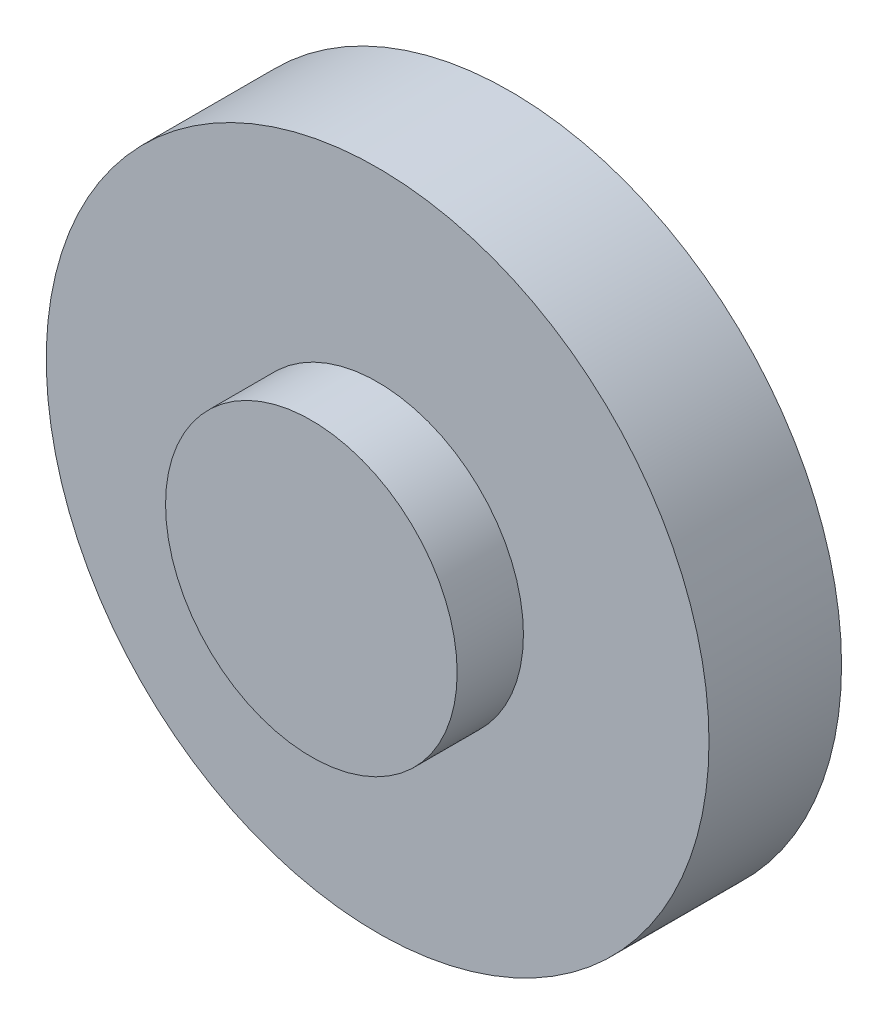
ISO-10303-21;
HEADER;
FILE_DESCRIPTION(('STEP AP214'),'2;1');
FILE_NAME('part.step','',(''),(''),'','','');
FILE_SCHEMA(('AUTOMOTIVE_DESIGN { 1 0 10303 214 1 1 1 1 }'));
ENDSEC;
DATA;
#1=APPLICATION_CONTEXT('core data for automotive mechanical design processes');
#2=APPLICATION_PROTOCOL_DEFINITION('international standard','automotive_design',2000,#1);
#3=PRODUCT_CONTEXT('',#1,'mechanical');
#4=PRODUCT('Part','Part','',(#3));
#5=PRODUCT_RELATED_PRODUCT_CATEGORY('part','',(#4));
#6=PRODUCT_DEFINITION_FORMATION('','',#4);
#7=PRODUCT_DEFINITION_CONTEXT('part definition',#1,'design');
#8=PRODUCT_DEFINITION('design','',#6,#7);
#9=PRODUCT_DEFINITION_SHAPE('','',#8);
#10=(LENGTH_UNIT() NAMED_UNIT(*) SI_UNIT(.MILLI.,.METRE.));
#11=(NAMED_UNIT(*) PLANE_ANGLE_UNIT() SI_UNIT($,.RADIAN.));
#12=(NAMED_UNIT(*) SI_UNIT($,.STERADIAN.) SOLID_ANGLE_UNIT());
#13=UNCERTAINTY_MEASURE_WITH_UNIT(LENGTH_MEASURE(1.E-05),#10,'distance_accuracy_value','');
#14=(GEOMETRIC_REPRESENTATION_CONTEXT(3) GLOBAL_UNCERTAINTY_ASSIGNED_CONTEXT((#13)) GLOBAL_UNIT_ASSIGNED_CONTEXT((#10,
#11,#12)) REPRESENTATION_CONTEXT('',''));
#15=CARTESIAN_POINT('',(0.,0.,0.));
#16=DIRECTION('',(0.,0.,1.));
#17=DIRECTION('',(1.,0.,0.));
#18=AXIS2_PLACEMENT_3D('',#15,#16,#17);
#19=CARTESIAN_POINT('',(0.,0.,10.));
#20=DIRECTION('',(0.,0.,1.));
#21=DIRECTION('',(1.,0.,0.));
#22=AXIS2_PLACEMENT_3D('',#19,#20,#21);
#23=PLANE('',#22);
#24=CARTESIAN_POINT('',(0.,0.,10.));
#25=DIRECTION('',(0.,0.,1.));
#26=DIRECTION('',(1.,0.,0.));
#27=AXIS2_PLACEMENT_3D('',#24,#25,#26);
#28=CIRCLE('',#27,25.);
#29=CARTESIAN_POINT('',(25.,0.,10.));
#30=VERTEX_POINT('',#29);
#31=EDGE_CURVE('E10',#30,#30,#28,.T.);
#32=ORIENTED_EDGE('',*,*,#31,.T.);
#33=EDGE_LOOP('',(#32));
#34=FACE_BOUND('',#33,.T.);
#35=CARTESIAN_POINT('',(0.,0.,10.));
#36=DIRECTION('',(0.,0.,1.));
#37=DIRECTION('',(1.,0.,0.));
#38=AXIS2_PLACEMENT_3D('',#35,#36,#37);
#39=CIRCLE('',#38,11.);
#40=CARTESIAN_POINT('',(11.,0.,10.));
#41=VERTEX_POINT('',#40);
#42=EDGE_CURVE('E44',#41,#41,#39,.T.);
#43=ORIENTED_EDGE('',*,*,#42,.F.);
#44=EDGE_LOOP('',(#43));
#45=FACE_BOUND('',#44,.T.);
#46=ADVANCED_FACE('F31',(#34,#45),#23,.T.);
#47=CARTESIAN_POINT('',(0.,0.,10.));
#48=DIRECTION('',(0.,0.,-1.));
#49=DIRECTION('',(-1.,0.,0.));
#50=AXIS2_PLACEMENT_3D('',#47,#48,#49);
#51=CYLINDRICAL_SURFACE('',#50,25.);
#52=ORIENTED_EDGE('',*,*,#31,.F.);
#53=EDGE_LOOP('',(#52));
#54=FACE_BOUND('',#53,.T.);
#55=CARTESIAN_POINT('',(0.,0.,0.));
#56=DIRECTION('',(0.,0.,1.));
#57=DIRECTION('',(1.,0.,0.));
#58=AXIS2_PLACEMENT_3D('',#55,#56,#57);
#59=CIRCLE('',#58,25.);
#60=CARTESIAN_POINT('',(25.,0.,0.));
#61=VERTEX_POINT('',#60);
#62=EDGE_CURVE('E35',#61,#61,#59,.T.);
#63=ORIENTED_EDGE('',*,*,#62,.T.);
#64=EDGE_LOOP('',(#63));
#65=FACE_BOUND('',#64,.T.);
#66=ADVANCED_FACE('F33',(#54,#65),#51,.T.);
#67=CARTESIAN_POINT('',(0.,0.,0.));
#68=DIRECTION('',(0.,0.,1.));
#69=DIRECTION('',(1.,0.,0.));
#70=AXIS2_PLACEMENT_3D('',#67,#68,#69);
#71=PLANE('',#70);
#72=ORIENTED_EDGE('',*,*,#62,.F.);
#73=EDGE_LOOP('',(#72));
#74=FACE_BOUND('',#73,.T.);
#75=ADVANCED_FACE('F55',(#74),#71,.F.);
#76=CARTESIAN_POINT('',(0.,0.,15.));
#77=DIRECTION('',(0.,0.,-1.));
#78=DIRECTION('',(-1.,0.,0.));
#79=AXIS2_PLACEMENT_3D('',#76,#77,#78);
#80=CYLINDRICAL_SURFACE('',#79,11.);
#81=CARTESIAN_POINT('',(0.,0.,15.));
#82=DIRECTION('',(0.,0.,1.));
#83=DIRECTION('',(1.,0.,0.));
#84=AXIS2_PLACEMENT_3D('',#81,#82,#83);
#85=CIRCLE('',#84,11.);
#86=CARTESIAN_POINT('',(11.,0.,15.));
#87=VERTEX_POINT('',#86);
#88=EDGE_CURVE('E42',#87,#87,#85,.T.);
#89=ORIENTED_EDGE('',*,*,#88,.F.);
#90=EDGE_LOOP('',(#89));
#91=FACE_BOUND('',#90,.T.);
#92=ORIENTED_EDGE('',*,*,#42,.T.);
#93=EDGE_LOOP('',(#92));
#94=FACE_BOUND('',#93,.T.);
#95=ADVANCED_FACE('F52',(#91,#94),#80,.T.);
#96=CARTESIAN_POINT('',(0.,0.,15.));
#97=DIRECTION('',(0.,0.,1.));
#98=DIRECTION('',(1.,0.,0.));
#99=AXIS2_PLACEMENT_3D('',#96,#97,#98);
#100=PLANE('',#99);
#101=ORIENTED_EDGE('',*,*,#88,.T.);
#102=EDGE_LOOP('',(#101));
#103=FACE_BOUND('',#102,.T.);
#104=ADVANCED_FACE('F50',(#103),#100,.T.);
#105=CLOSED_SHELL('',(#46,#66,#75,#95,#104));
#106=MANIFOLD_SOLID_BREP('B2',#105);
#107=ADVANCED_BREP_SHAPE_REPRESENTATION('',(#18,#106),#14);
#108=SHAPE_DEFINITION_REPRESENTATION(#9,#107);
ENDSEC;
END-ISO-10303-21;
